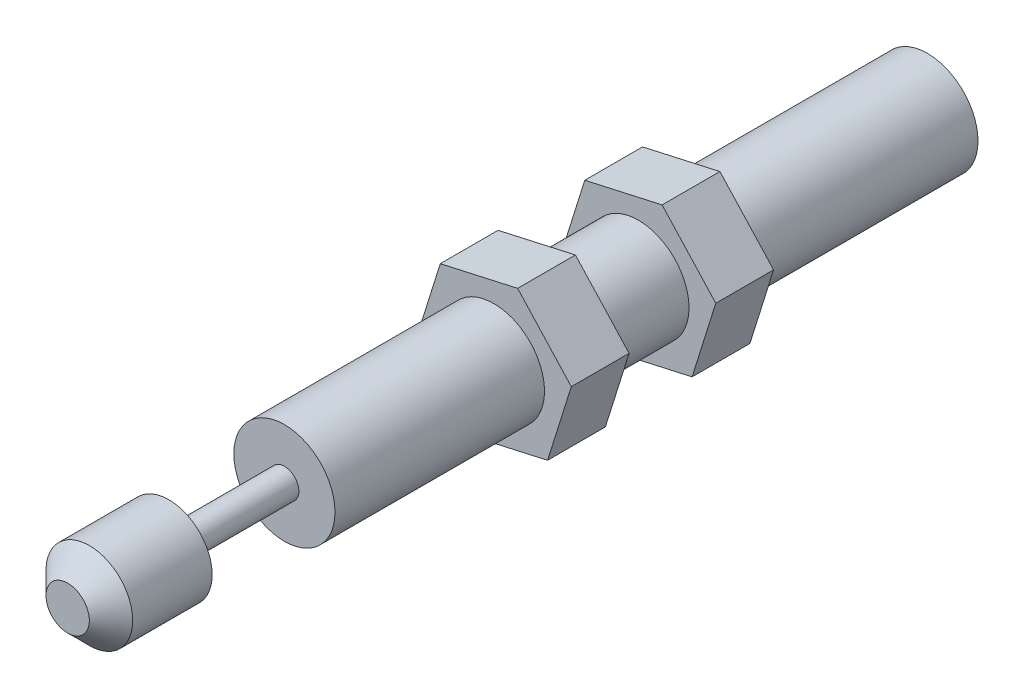
ISO-10303-21;
HEADER;
FILE_DESCRIPTION(('STEP AP214'),'2;1');
FILE_NAME('part.step','',(''),(''),'','','');
FILE_SCHEMA(('AUTOMOTIVE_DESIGN { 1 0 10303 214 1 1 1 1 }'));
ENDSEC;
DATA;
#1=APPLICATION_CONTEXT('core data for automotive mechanical design processes');
#2=APPLICATION_PROTOCOL_DEFINITION('international standard','automotive_design',2000,#1);
#3=PRODUCT_CONTEXT('',#1,'mechanical');
#4=PRODUCT('Part','Part','',(#3));
#5=PRODUCT_RELATED_PRODUCT_CATEGORY('part','',(#4));
#6=PRODUCT_DEFINITION_FORMATION('','',#4);
#7=PRODUCT_DEFINITION_CONTEXT('part definition',#1,'design');
#8=PRODUCT_DEFINITION('design','',#6,#7);
#9=PRODUCT_DEFINITION_SHAPE('','',#8);
#10=(LENGTH_UNIT() NAMED_UNIT(*) SI_UNIT(.MILLI.,.METRE.));
#11=(NAMED_UNIT(*) PLANE_ANGLE_UNIT() SI_UNIT($,.RADIAN.));
#12=(NAMED_UNIT(*) SI_UNIT($,.STERADIAN.) SOLID_ANGLE_UNIT());
#13=UNCERTAINTY_MEASURE_WITH_UNIT(LENGTH_MEASURE(1.E-05),#10,'distance_accuracy_value','');
#14=(GEOMETRIC_REPRESENTATION_CONTEXT(3) GLOBAL_UNCERTAINTY_ASSIGNED_CONTEXT((#13)) GLOBAL_UNIT_ASSIGNED_CONTEXT((#10,
#11,#12)) REPRESENTATION_CONTEXT('',''));
#15=CARTESIAN_POINT('',(0.,0.,0.));
#16=DIRECTION('',(0.,0.,1.));
#17=DIRECTION('',(1.,0.,0.));
#18=AXIS2_PLACEMENT_3D('',#15,#16,#17);
#19=CARTESIAN_POINT('',(0.,0.,89.));
#20=DIRECTION('',(0.,0.,-1.));
#21=DIRECTION('',(-1.,0.,0.));
#22=AXIS2_PLACEMENT_3D('',#19,#20,#21);
#23=CYLINDRICAL_SURFACE('',#22,7.);
#24=CARTESIAN_POINT('',(0.,0.,89.));
#25=DIRECTION('',(0.,0.,1.));
#26=DIRECTION('',(1.,0.,0.));
#27=AXIS2_PLACEMENT_3D('',#24,#25,#26);
#28=CIRCLE('',#27,7.);
#29=CARTESIAN_POINT('',(7.,0.,89.));
#30=VERTEX_POINT('',#29);
#31=EDGE_CURVE('E156',#30,#30,#28,.T.);
#32=ORIENTED_EDGE('',*,*,#31,.F.);
#33=EDGE_LOOP('',(#32));
#34=FACE_BOUND('',#33,.T.);
#35=CARTESIAN_POINT('',(0.,0.,60.));
#36=DIRECTION('',(0.,0.,-1.));
#37=DIRECTION('',(-1.,0.,0.));
#38=AXIS2_PLACEMENT_3D('',#35,#36,#37);
#39=CIRCLE('',#38,7.);
#40=CARTESIAN_POINT('',(-7.,0.,60.));
#41=VERTEX_POINT('',#40);
#42=EDGE_CURVE('E11',#41,#41,#39,.T.);
#43=ORIENTED_EDGE('',*,*,#42,.F.);
#44=EDGE_LOOP('',(#43));
#45=FACE_BOUND('',#44,.T.);
#46=ADVANCED_FACE('F34',(#34,#45),#23,.T.);
#47=CARTESIAN_POINT('',(0.,0.,89.));
#48=DIRECTION('',(0.,0.,1.));
#49=DIRECTION('',(1.,0.,0.));
#50=AXIS2_PLACEMENT_3D('',#47,#48,#49);
#51=PLANE('',#50);
#52=ORIENTED_EDGE('',*,*,#31,.T.);
#53=EDGE_LOOP('',(#52));
#54=FACE_BOUND('',#53,.T.);
#55=CARTESIAN_POINT('',(0.,0.,89.));
#56=DIRECTION('',(0.,0.,1.));
#57=DIRECTION('',(1.,0.,0.));
#58=AXIS2_PLACEMENT_3D('',#55,#56,#57);
#59=CIRCLE('',#58,2.);
#60=CARTESIAN_POINT('',(2.,0.,89.));
#61=VERTEX_POINT('',#60);
#62=EDGE_CURVE('E149',#61,#61,#59,.T.);
#63=ORIENTED_EDGE('',*,*,#62,.F.);
#64=EDGE_LOOP('',(#63));
#65=FACE_BOUND('',#64,.T.);
#66=ADVANCED_FACE('F188',(#54,#65),#51,.T.);
#67=CARTESIAN_POINT('',(0.,0.,105.));
#68=DIRECTION('',(0.,0.,-1.));
#69=DIRECTION('',(-1.,0.,0.));
#70=AXIS2_PLACEMENT_3D('',#67,#68,#69);
#71=CYLINDRICAL_SURFACE('',#70,2.);
#72=CARTESIAN_POINT('',(0.,0.,105.));
#73=DIRECTION('',(0.,0.,1.));
#74=DIRECTION('',(1.,0.,0.));
#75=AXIS2_PLACEMENT_3D('',#72,#73,#74);
#76=CIRCLE('',#75,2.);
#77=CARTESIAN_POINT('',(2.,0.,105.));
#78=VERTEX_POINT('',#77);
#79=EDGE_CURVE('E150',#78,#78,#76,.T.);
#80=ORIENTED_EDGE('',*,*,#79,.F.);
#81=EDGE_LOOP('',(#80));
#82=FACE_BOUND('',#81,.T.);
#83=ORIENTED_EDGE('',*,*,#62,.T.);
#84=EDGE_LOOP('',(#83));
#85=FACE_BOUND('',#84,.T.);
#86=ADVANCED_FACE('F193',(#82,#85),#71,.T.);
#87=CARTESIAN_POINT('',(0.,0.,105.));
#88=DIRECTION('',(0.,0.,1.));
#89=DIRECTION('',(1.,0.,0.));
#90=AXIS2_PLACEMENT_3D('',#87,#88,#89);
#91=PLANE('',#90);
#92=CARTESIAN_POINT('',(0.,0.,105.));
#93=DIRECTION('',(0.,0.,1.));
#94=DIRECTION('',(1.,0.,0.));
#95=AXIS2_PLACEMENT_3D('',#92,#93,#94);
#96=CIRCLE('',#95,6.);
#97=CARTESIAN_POINT('',(6.,0.,105.));
#98=VERTEX_POINT('',#97);
#99=EDGE_CURVE('E146',#98,#98,#96,.T.);
#100=ORIENTED_EDGE('',*,*,#99,.F.);
#101=EDGE_LOOP('',(#100));
#102=FACE_BOUND('',#101,.T.);
#103=ORIENTED_EDGE('',*,*,#79,.T.);
#104=EDGE_LOOP('',(#103));
#105=FACE_BOUND('',#104,.T.);
#106=ADVANCED_FACE('F254',(#102,#105),#91,.F.);
#107=CARTESIAN_POINT('',(0.,0.,119.));
#108=DIRECTION('',(0.,0.,-1.));
#109=DIRECTION('',(-1.,0.,0.));
#110=AXIS2_PLACEMENT_3D('',#107,#108,#109);
#111=CYLINDRICAL_SURFACE('',#110,6.);
#112=CARTESIAN_POINT('',(0.,0.,116.));
#113=DIRECTION('',(0.,0.,1.));
#114=DIRECTION('',(1.,0.,0.));
#115=AXIS2_PLACEMENT_3D('',#112,#113,#114);
#116=CIRCLE('',#115,6.);
#117=CARTESIAN_POINT('',(6.,0.,116.));
#118=VERTEX_POINT('',#117);
#119=EDGE_CURVE('E164',#118,#118,#116,.F.);
#120=ORIENTED_EDGE('',*,*,#119,.T.);
#121=EDGE_LOOP('',(#120));
#122=FACE_BOUND('',#121,.T.);
#123=ORIENTED_EDGE('',*,*,#99,.T.);
#124=EDGE_LOOP('',(#123));
#125=FACE_BOUND('',#124,.T.);
#126=ADVANCED_FACE('F252',(#122,#125),#111,.T.);
#127=CARTESIAN_POINT('',(0.,0.,119.));
#128=DIRECTION('',(0.,0.,1.));
#129=DIRECTION('',(1.,0.,0.));
#130=AXIS2_PLACEMENT_3D('',#127,#128,#129);
#131=PLANE('',#130);
#132=CARTESIAN_POINT('',(0.,0.,119.));
#133=DIRECTION('',(0.,0.,1.));
#134=DIRECTION('',(1.,0.,0.));
#135=AXIS2_PLACEMENT_3D('',#132,#133,#134);
#136=CIRCLE('',#135,2.99999999999996);
#137=CARTESIAN_POINT('',(2.99999999999996,0.,119.));
#138=VERTEX_POINT('',#137);
#139=EDGE_CURVE('E159',#138,#138,#136,.T.);
#140=ORIENTED_EDGE('',*,*,#139,.T.);
#141=EDGE_LOOP('',(#140));
#142=FACE_BOUND('',#141,.T.);
#143=ADVANCED_FACE('F249',(#142),#131,.T.);
#144=CARTESIAN_POINT('',(0.,0.,119.));
#145=DIRECTION('',(0.,0.,-1.));
#146=DIRECTION('',(-1.,0.,0.));
#147=AXIS2_PLACEMENT_3D('',#144,#145,#146);
#148=CONICAL_SURFACE('',#147,2.99999999999996,0.785398163397448);
#149=ORIENTED_EDGE('',*,*,#119,.F.);
#150=EDGE_LOOP('',(#149));
#151=FACE_BOUND('',#150,.T.);
#152=ORIENTED_EDGE('',*,*,#139,.F.);
#153=EDGE_LOOP('',(#152));
#154=FACE_BOUND('',#153,.T.);
#155=ADVANCED_FACE('F36',(#151,#154),#148,.T.);
#156=CARTESIAN_POINT('',(3.27780569084184,10.4684919251255,52.));
#157=DIRECTION('',(0.,0.,-1.));
#158=DIRECTION('',(-1.,0.,0.));
#159=AXIS2_PLACEMENT_3D('',#156,#157,#158);
#160=PLANE('',#159);
#161=DIRECTION('',(0.975863204454027,0.218382705800432,0.));
#162=VECTOR('',#161,1.);
#163=CARTESIAN_POINT('',(-7.42707710105005,8.07290895950099,52.));
#164=LINE('',#163,#162);
#165=CARTESIAN_POINT('',(-7.42707710105005,8.07290895950099,52.));
#166=VERTEX_POINT('',#165);
#167=CARTESIAN_POINT('',(3.27780569084183,10.4684919251255,52.));
#168=VERTEX_POINT('',#167);
#169=EDGE_CURVE('E330',#166,#168,#164,.T.);
#170=ORIENTED_EDGE('',*,*,#169,.T.);
#171=DIRECTION('',(0.677056573197371,-0.735930972775459,0.));
#172=VECTOR('',#171,1.);
#173=CARTESIAN_POINT('',(3.27780569084183,10.4684919251255,52.));
#174=LINE('',#173,#172);
#175=CARTESIAN_POINT('',(10.7048827918919,2.39558296562453,52.));
#176=VERTEX_POINT('',#175);
#177=EDGE_CURVE('E370',#168,#176,#174,.T.);
#178=ORIENTED_EDGE('',*,*,#177,.T.);
#179=DIRECTION('',(-0.298806631256656,-0.954313678575891,0.));
#180=VECTOR('',#179,1.);
#181=CARTESIAN_POINT('',(10.7048827918919,2.39558296562453,52.));
#182=LINE('',#181,#180);
#183=CARTESIAN_POINT('',(7.42707710105005,-8.07290895950099,52.));
#184=VERTEX_POINT('',#183);
#185=EDGE_CURVE('E365',#176,#184,#182,.T.);
#186=ORIENTED_EDGE('',*,*,#185,.T.);
#187=DIRECTION('',(-0.975863204454027,-0.218382705800433,0.));
#188=VECTOR('',#187,1.);
#189=CARTESIAN_POINT('',(7.42707710105005,-8.07290895950099,52.));
#190=LINE('',#189,#188);
#191=CARTESIAN_POINT('',(-3.27780569084183,-10.4684919251255,52.));
#192=VERTEX_POINT('',#191);
#193=EDGE_CURVE('E346',#184,#192,#190,.T.);
#194=ORIENTED_EDGE('',*,*,#193,.T.);
#195=DIRECTION('',(-0.677056573197371,0.735930972775459,0.));
#196=VECTOR('',#195,1.);
#197=CARTESIAN_POINT('',(-3.27780569084183,-10.4684919251255,52.));
#198=LINE('',#197,#196);
#199=CARTESIAN_POINT('',(-10.7048827918919,-2.39558296562453,52.));
#200=VERTEX_POINT('',#199);
#201=EDGE_CURVE('E364',#192,#200,#198,.T.);
#202=ORIENTED_EDGE('',*,*,#201,.T.);
#203=DIRECTION('',(0.298806631256656,0.954313678575891,0.));
#204=VECTOR('',#203,1.);
#205=CARTESIAN_POINT('',(-10.7048827918919,-2.39558296562453,52.));
#206=LINE('',#205,#204);
#207=EDGE_CURVE('E317',#200,#166,#206,.T.);
#208=ORIENTED_EDGE('',*,*,#207,.T.);
#209=EDGE_LOOP('',(#170,#178,#186,#194,#202,#208));
#210=FACE_BOUND('',#209,.T.);
#211=CARTESIAN_POINT('',(0.,0.,52.));
#212=DIRECTION('',(0.,0.,-1.));
#213=DIRECTION('',(-1.,0.,0.));
#214=AXIS2_PLACEMENT_3D('',#211,#212,#213);
#215=CIRCLE('',#214,7.);
#216=CARTESIAN_POINT('',(-7.,0.,52.));
#217=VERTEX_POINT('',#216);
#218=EDGE_CURVE('E38',#217,#217,#215,.T.);
#219=ORIENTED_EDGE('',*,*,#218,.F.);
#220=EDGE_LOOP('',(#219));
#221=FACE_BOUND('',#220,.T.);
#222=ADVANCED_FACE('F299',(#210,#221),#160,.T.);
#223=CARTESIAN_POINT('',(3.27780569084184,10.4684919251255,60.));
#224=DIRECTION('',(0.,0.,-1.));
#225=DIRECTION('',(-1.,0.,0.));
#226=AXIS2_PLACEMENT_3D('',#223,#224,#225);
#227=PLANE('',#226);
#228=DIRECTION('',(0.975863204454027,0.218382705800432,0.));
#229=VECTOR('',#228,1.);
#230=CARTESIAN_POINT('',(-7.42707710105005,8.07290895950099,60.));
#231=LINE('',#230,#229);
#232=CARTESIAN_POINT('',(-7.42707710105005,8.07290895950099,60.));
#233=VERTEX_POINT('',#232);
#234=CARTESIAN_POINT('',(3.27780569084183,10.4684919251255,60.));
#235=VERTEX_POINT('',#234);
#236=EDGE_CURVE('E303',#233,#235,#231,.T.);
#237=ORIENTED_EDGE('',*,*,#236,.F.);
#238=DIRECTION('',(0.298806631256656,0.954313678575891,0.));
#239=VECTOR('',#238,1.);
#240=CARTESIAN_POINT('',(-10.7048827918919,-2.39558296562453,60.));
#241=LINE('',#240,#239);
#242=CARTESIAN_POINT('',(-10.7048827918919,-2.39558296562453,60.));
#243=VERTEX_POINT('',#242);
#244=EDGE_CURVE('E328',#243,#233,#241,.T.);
#245=ORIENTED_EDGE('',*,*,#244,.F.);
#246=DIRECTION('',(-0.677056573197371,0.735930972775459,0.));
#247=VECTOR('',#246,1.);
#248=CARTESIAN_POINT('',(-3.27780569084183,-10.4684919251255,60.));
#249=LINE('',#248,#247);
#250=CARTESIAN_POINT('',(-3.27780569084183,-10.4684919251255,60.));
#251=VERTEX_POINT('',#250);
#252=EDGE_CURVE('E325',#251,#243,#249,.T.);
#253=ORIENTED_EDGE('',*,*,#252,.F.);
#254=DIRECTION('',(-0.975863204454027,-0.218382705800433,0.));
#255=VECTOR('',#254,1.);
#256=CARTESIAN_POINT('',(7.42707710105005,-8.07290895950099,60.));
#257=LINE('',#256,#255);
#258=CARTESIAN_POINT('',(7.42707710105005,-8.07290895950099,60.));
#259=VERTEX_POINT('',#258);
#260=EDGE_CURVE('E322',#259,#251,#257,.T.);
#261=ORIENTED_EDGE('',*,*,#260,.F.);
#262=DIRECTION('',(-0.298806631256656,-0.954313678575891,0.));
#263=VECTOR('',#262,1.);
#264=CARTESIAN_POINT('',(10.7048827918919,2.39558296562453,60.));
#265=LINE('',#264,#263);
#266=CARTESIAN_POINT('',(10.7048827918919,2.39558296562453,60.));
#267=VERTEX_POINT('',#266);
#268=EDGE_CURVE('E314',#267,#259,#265,.T.);
#269=ORIENTED_EDGE('',*,*,#268,.F.);
#270=DIRECTION('',(0.677056573197371,-0.735930972775459,0.));
#271=VECTOR('',#270,1.);
#272=CARTESIAN_POINT('',(3.27780569084183,10.4684919251255,60.));
#273=LINE('',#272,#271);
#274=EDGE_CURVE('E312',#235,#267,#273,.T.);
#275=ORIENTED_EDGE('',*,*,#274,.F.);
#276=EDGE_LOOP('',(#237,#245,#253,#261,#269,#275));
#277=FACE_BOUND('',#276,.T.);
#278=ORIENTED_EDGE('',*,*,#42,.T.);
#279=EDGE_LOOP('',(#278));
#280=FACE_BOUND('',#279,.T.);
#281=ADVANCED_FACE('F281',(#277,#280),#227,.F.);
#282=CARTESIAN_POINT('',(-7.42707710105005,8.07290895950099,52.));
#283=DIRECTION('',(0.218382705800432,-0.975863204454027,0.));
#284=DIRECTION('',(0.975863204454027,0.218382705800432,0.));
#285=AXIS2_PLACEMENT_3D('',#282,#283,#284);
#286=PLANE('',#285);
#287=ORIENTED_EDGE('',*,*,#236,.T.);
#288=DIRECTION('',(0.,0.,1.));
#289=VECTOR('',#288,1.);
#290=CARTESIAN_POINT('',(3.27780569084183,10.4684919251255,52.));
#291=LINE('',#290,#289);
#292=EDGE_CURVE('E213',#168,#235,#291,.T.);
#293=ORIENTED_EDGE('',*,*,#292,.F.);
#294=ORIENTED_EDGE('',*,*,#169,.F.);
#295=DIRECTION('',(0.,0.,1.));
#296=VECTOR('',#295,1.);
#297=CARTESIAN_POINT('',(-7.42707710105005,8.07290895950099,52.));
#298=LINE('',#297,#296);
#299=EDGE_CURVE('E307',#166,#233,#298,.T.);
#300=ORIENTED_EDGE('',*,*,#299,.T.);
#301=EDGE_LOOP('',(#287,#293,#294,#300));
#302=FACE_BOUND('',#301,.T.);
#303=ADVANCED_FACE('F293',(#302),#286,.F.);
#304=CARTESIAN_POINT('',(3.27780569084183,10.4684919251255,52.));
#305=DIRECTION('',(-0.735930972775459,-0.677056573197371,0.));
#306=DIRECTION('',(0.677056573197371,-0.735930972775459,0.));
#307=AXIS2_PLACEMENT_3D('',#304,#305,#306);
#308=PLANE('',#307);
#309=ORIENTED_EDGE('',*,*,#274,.T.);
#310=DIRECTION('',(0.,0.,1.));
#311=VECTOR('',#310,1.);
#312=CARTESIAN_POINT('',(10.7048827918919,2.39558296562453,52.));
#313=LINE('',#312,#311);
#314=EDGE_CURVE('E215',#176,#267,#313,.T.);
#315=ORIENTED_EDGE('',*,*,#314,.F.);
#316=ORIENTED_EDGE('',*,*,#177,.F.);
#317=ORIENTED_EDGE('',*,*,#292,.T.);
#318=EDGE_LOOP('',(#309,#315,#316,#317));
#319=FACE_BOUND('',#318,.T.);
#320=ADVANCED_FACE('F290',(#319),#308,.F.);
#321=CARTESIAN_POINT('',(10.7048827918919,2.39558296562453,52.));
#322=DIRECTION('',(-0.954313678575891,0.298806631256656,0.));
#323=DIRECTION('',(-0.298806631256656,-0.954313678575891,0.));
#324=AXIS2_PLACEMENT_3D('',#321,#322,#323);
#325=PLANE('',#324);
#326=ORIENTED_EDGE('',*,*,#268,.T.);
#327=DIRECTION('',(0.,0.,1.));
#328=VECTOR('',#327,1.);
#329=CARTESIAN_POINT('',(7.42707710105005,-8.07290895950099,52.));
#330=LINE('',#329,#328);
#331=EDGE_CURVE('E224',#184,#259,#330,.T.);
#332=ORIENTED_EDGE('',*,*,#331,.F.);
#333=ORIENTED_EDGE('',*,*,#185,.F.);
#334=ORIENTED_EDGE('',*,*,#314,.T.);
#335=EDGE_LOOP('',(#326,#332,#333,#334));
#336=FACE_BOUND('',#335,.T.);
#337=ADVANCED_FACE('F286',(#336),#325,.F.);
#338=CARTESIAN_POINT('',(7.42707710105005,-8.07290895950099,52.));
#339=DIRECTION('',(-0.218382705800433,0.975863204454027,0.));
#340=DIRECTION('',(-0.975863204454027,-0.218382705800433,0.));
#341=AXIS2_PLACEMENT_3D('',#338,#339,#340);
#342=PLANE('',#341);
#343=ORIENTED_EDGE('',*,*,#260,.T.);
#344=DIRECTION('',(0.,0.,1.));
#345=VECTOR('',#344,1.);
#346=CARTESIAN_POINT('',(-3.27780569084183,-10.4684919251255,52.));
#347=LINE('',#346,#345);
#348=EDGE_CURVE('E335',#192,#251,#347,.T.);
#349=ORIENTED_EDGE('',*,*,#348,.F.);
#350=ORIENTED_EDGE('',*,*,#193,.F.);
#351=ORIENTED_EDGE('',*,*,#331,.T.);
#352=EDGE_LOOP('',(#343,#349,#350,#351));
#353=FACE_BOUND('',#352,.T.);
#354=ADVANCED_FACE('F276',(#353),#342,.F.);
#355=CARTESIAN_POINT('',(-3.27780569084183,-10.4684919251255,52.));
#356=DIRECTION('',(0.735930972775459,0.677056573197371,0.));
#357=DIRECTION('',(-0.677056573197371,0.735930972775459,0.));
#358=AXIS2_PLACEMENT_3D('',#355,#356,#357);
#359=PLANE('',#358);
#360=ORIENTED_EDGE('',*,*,#252,.T.);
#361=DIRECTION('',(0.,0.,1.));
#362=VECTOR('',#361,1.);
#363=CARTESIAN_POINT('',(-10.7048827918919,-2.39558296562453,52.));
#364=LINE('',#363,#362);
#365=EDGE_CURVE('E332',#200,#243,#364,.T.);
#366=ORIENTED_EDGE('',*,*,#365,.F.);
#367=ORIENTED_EDGE('',*,*,#201,.F.);
#368=ORIENTED_EDGE('',*,*,#348,.T.);
#369=EDGE_LOOP('',(#360,#366,#367,#368));
#370=FACE_BOUND('',#369,.T.);
#371=ADVANCED_FACE('F269',(#370),#359,.F.);
#372=CARTESIAN_POINT('',(-10.7048827918919,-2.39558296562453,52.));
#373=DIRECTION('',(0.954313678575891,-0.298806631256656,0.));
#374=DIRECTION('',(0.298806631256656,0.954313678575891,0.));
#375=AXIS2_PLACEMENT_3D('',#372,#373,#374);
#376=PLANE('',#375);
#377=ORIENTED_EDGE('',*,*,#244,.T.);
#378=ORIENTED_EDGE('',*,*,#299,.F.);
#379=ORIENTED_EDGE('',*,*,#207,.F.);
#380=ORIENTED_EDGE('',*,*,#365,.T.);
#381=EDGE_LOOP('',(#377,#378,#379,#380));
#382=FACE_BOUND('',#381,.T.);
#383=ADVANCED_FACE('F264',(#382),#376,.F.);
#384=CARTESIAN_POINT('',(0.,0.,0.));
#385=DIRECTION('',(0.,0.,1.));
#386=DIRECTION('',(1.,0.,0.));
#387=AXIS2_PLACEMENT_3D('',#384,#385,#386);
#388=PLANE('',#387);
#389=CARTESIAN_POINT('',(0.,0.,0.));
#390=DIRECTION('',(0.,0.,1.));
#391=DIRECTION('',(1.,0.,0.));
#392=AXIS2_PLACEMENT_3D('',#389,#390,#391);
#393=CIRCLE('',#392,7.);
#394=CARTESIAN_POINT('',(7.,0.,0.));
#395=VERTEX_POINT('',#394);
#396=EDGE_CURVE('E153',#395,#395,#393,.T.);
#397=ORIENTED_EDGE('',*,*,#396,.F.);
#398=EDGE_LOOP('',(#397));
#399=FACE_BOUND('',#398,.T.);
#400=ADVANCED_FACE('F183',(#399),#388,.F.);
#401=CARTESIAN_POINT('',(0.,0.,32.));
#402=DIRECTION('',(0.,0.,-1.));
#403=DIRECTION('',(-1.,0.,0.));
#404=AXIS2_PLACEMENT_3D('',#401,#402,#403);
#405=CIRCLE('',#404,7.);
#406=CARTESIAN_POINT('',(-7.,0.,32.));
#407=VERTEX_POINT('',#406);
#408=EDGE_CURVE('E145',#407,#407,#405,.T.);
#409=ORIENTED_EDGE('',*,*,#408,.T.);
#410=EDGE_LOOP('',(#409));
#411=FACE_BOUND('',#410,.T.);
#412=ORIENTED_EDGE('',*,*,#396,.T.);
#413=EDGE_LOOP('',(#412));
#414=FACE_BOUND('',#413,.T.);
#415=ADVANCED_FACE('F172',(#411,#414),#23,.T.);
#416=CARTESIAN_POINT('',(3.27780569084184,10.4684919251255,32.));
#417=DIRECTION('',(0.,0.,-1.));
#418=DIRECTION('',(-1.,0.,0.));
#419=AXIS2_PLACEMENT_3D('',#416,#417,#418);
#420=PLANE('',#419);
#421=DIRECTION('',(0.975863204454027,0.218382705800432,0.));
#422=VECTOR('',#421,1.);
#423=CARTESIAN_POINT('',(-7.42707710105005,8.07290895950099,32.));
#424=LINE('',#423,#422);
#425=CARTESIAN_POINT('',(-7.42707710105005,8.07290895950099,32.));
#426=VERTEX_POINT('',#425);
#427=CARTESIAN_POINT('',(3.27780569084183,10.4684919251255,32.));
#428=VERTEX_POINT('',#427);
#429=EDGE_CURVE('E136',#426,#428,#424,.T.);
#430=ORIENTED_EDGE('',*,*,#429,.T.);
#431=DIRECTION('',(0.677056573197371,-0.735930972775459,0.));
#432=VECTOR('',#431,1.);
#433=CARTESIAN_POINT('',(3.27780569084183,10.4684919251255,32.));
#434=LINE('',#433,#432);
#435=CARTESIAN_POINT('',(10.7048827918919,2.39558296562453,32.));
#436=VERTEX_POINT('',#435);
#437=EDGE_CURVE('E91',#428,#436,#434,.T.);
#438=ORIENTED_EDGE('',*,*,#437,.T.);
#439=DIRECTION('',(-0.298806631256656,-0.954313678575891,0.));
#440=VECTOR('',#439,1.);
#441=CARTESIAN_POINT('',(10.7048827918919,2.39558296562453,32.));
#442=LINE('',#441,#440);
#443=CARTESIAN_POINT('',(7.42707710105005,-8.07290895950099,32.));
#444=VERTEX_POINT('',#443);
#445=EDGE_CURVE('E108',#436,#444,#442,.T.);
#446=ORIENTED_EDGE('',*,*,#445,.T.);
#447=DIRECTION('',(-0.975863204454027,-0.218382705800433,0.));
#448=VECTOR('',#447,1.);
#449=CARTESIAN_POINT('',(7.42707710105005,-8.07290895950099,32.));
#450=LINE('',#449,#448);
#451=CARTESIAN_POINT('',(-3.27780569084183,-10.4684919251255,32.));
#452=VERTEX_POINT('',#451);
#453=EDGE_CURVE('E101',#444,#452,#450,.T.);
#454=ORIENTED_EDGE('',*,*,#453,.T.);
#455=DIRECTION('',(-0.677056573197371,0.735930972775459,0.));
#456=VECTOR('',#455,1.);
#457=CARTESIAN_POINT('',(-3.27780569084183,-10.4684919251255,32.));
#458=LINE('',#457,#456);
#459=CARTESIAN_POINT('',(-10.7048827918919,-2.39558296562453,32.));
#460=VERTEX_POINT('',#459);
#461=EDGE_CURVE('E106',#452,#460,#458,.T.);
#462=ORIENTED_EDGE('',*,*,#461,.T.);
#463=DIRECTION('',(0.298806631256656,0.954313678575891,0.));
#464=VECTOR('',#463,1.);
#465=CARTESIAN_POINT('',(-10.7048827918919,-2.39558296562453,32.));
#466=LINE('',#465,#464);
#467=EDGE_CURVE('E52',#460,#426,#466,.T.);
#468=ORIENTED_EDGE('',*,*,#467,.T.);
#469=EDGE_LOOP('',(#430,#438,#446,#454,#462,#468));
#470=FACE_BOUND('',#469,.T.);
#471=ORIENTED_EDGE('',*,*,#408,.F.);
#472=EDGE_LOOP('',(#471));
#473=FACE_BOUND('',#472,.T.);
#474=ADVANCED_FACE('F103',(#470,#473),#420,.T.);
#475=CARTESIAN_POINT('',(3.27780569084183,10.4684919251255,32.));
#476=DIRECTION('',(-0.735930972775459,-0.677056573197371,0.));
#477=DIRECTION('',(0.677056573197371,-0.735930972775459,0.));
#478=AXIS2_PLACEMENT_3D('',#475,#476,#477);
#479=PLANE('',#478);
#480=DIRECTION('',(0.677056573197371,-0.735930972775459,0.));
#481=VECTOR('',#480,1.);
#482=CARTESIAN_POINT('',(3.27780569084183,10.4684919251255,40.));
#483=LINE('',#482,#481);
#484=CARTESIAN_POINT('',(3.27780569084183,10.4684919251255,40.));
#485=VERTEX_POINT('',#484);
#486=CARTESIAN_POINT('',(10.7048827918919,2.39558296562453,40.));
#487=VERTEX_POINT('',#486);
#488=EDGE_CURVE('E129',#485,#487,#483,.T.);
#489=ORIENTED_EDGE('',*,*,#488,.T.);
#490=DIRECTION('',(0.,0.,1.));
#491=VECTOR('',#490,1.);
#492=CARTESIAN_POINT('',(10.7048827918919,2.39558296562453,32.));
#493=LINE('',#492,#491);
#494=EDGE_CURVE('E140',#436,#487,#493,.T.);
#495=ORIENTED_EDGE('',*,*,#494,.F.);
#496=ORIENTED_EDGE('',*,*,#437,.F.);
#497=DIRECTION('',(0.,0.,1.));
#498=VECTOR('',#497,1.);
#499=CARTESIAN_POINT('',(3.27780569084183,10.4684919251255,32.));
#500=LINE('',#499,#498);
#501=EDGE_CURVE('E143',#428,#485,#500,.T.);
#502=ORIENTED_EDGE('',*,*,#501,.T.);
#503=EDGE_LOOP('',(#489,#495,#496,#502));
#504=FACE_BOUND('',#503,.T.);
#505=ADVANCED_FACE('F175',(#504),#479,.F.);
#506=CARTESIAN_POINT('',(10.7048827918919,2.39558296562453,32.));
#507=DIRECTION('',(-0.954313678575891,0.298806631256656,0.));
#508=DIRECTION('',(-0.298806631256656,-0.954313678575891,0.));
#509=AXIS2_PLACEMENT_3D('',#506,#507,#508);
#510=PLANE('',#509);
#511=DIRECTION('',(-0.298806631256656,-0.954313678575891,0.));
#512=VECTOR('',#511,1.);
#513=CARTESIAN_POINT('',(10.7048827918919,2.39558296562453,40.));
#514=LINE('',#513,#512);
#515=CARTESIAN_POINT('',(7.42707710105005,-8.07290895950099,40.));
#516=VERTEX_POINT('',#515);
#517=EDGE_CURVE('E131',#487,#516,#514,.T.);
#518=ORIENTED_EDGE('',*,*,#517,.T.);
#519=DIRECTION('',(0.,0.,1.));
#520=VECTOR('',#519,1.);
#521=CARTESIAN_POINT('',(7.42707710105005,-8.07290895950099,32.));
#522=LINE('',#521,#520);
#523=EDGE_CURVE('E117',#444,#516,#522,.T.);
#524=ORIENTED_EDGE('',*,*,#523,.F.);
#525=ORIENTED_EDGE('',*,*,#445,.F.);
#526=ORIENTED_EDGE('',*,*,#494,.T.);
#527=EDGE_LOOP('',(#518,#524,#525,#526));
#528=FACE_BOUND('',#527,.T.);
#529=ADVANCED_FACE('F181',(#528),#510,.F.);
#530=CARTESIAN_POINT('',(7.42707710105005,-8.07290895950099,32.));
#531=DIRECTION('',(-0.218382705800433,0.975863204454027,0.));
#532=DIRECTION('',(-0.975863204454027,-0.218382705800433,0.));
#533=AXIS2_PLACEMENT_3D('',#530,#531,#532);
#534=PLANE('',#533);
#535=DIRECTION('',(-0.975863204454027,-0.218382705800433,0.));
#536=VECTOR('',#535,1.);
#537=CARTESIAN_POINT('',(7.42707710105005,-8.07290895950099,40.));
#538=LINE('',#537,#536);
#539=CARTESIAN_POINT('',(-3.27780569084183,-10.4684919251255,40.));
#540=VERTEX_POINT('',#539);
#541=EDGE_CURVE('E116',#516,#540,#538,.T.);
#542=ORIENTED_EDGE('',*,*,#541,.T.);
#543=DIRECTION('',(0.,0.,1.));
#544=VECTOR('',#543,1.);
#545=CARTESIAN_POINT('',(-3.27780569084183,-10.4684919251255,32.));
#546=LINE('',#545,#544);
#547=EDGE_CURVE('E113',#452,#540,#546,.T.);
#548=ORIENTED_EDGE('',*,*,#547,.F.);
#549=ORIENTED_EDGE('',*,*,#453,.F.);
#550=ORIENTED_EDGE('',*,*,#523,.T.);
#551=EDGE_LOOP('',(#542,#548,#549,#550));
#552=FACE_BOUND('',#551,.T.);
#553=ADVANCED_FACE('F114',(#552),#534,.F.);
#554=CARTESIAN_POINT('',(-3.27780569084183,-10.4684919251255,32.));
#555=DIRECTION('',(0.735930972775459,0.677056573197371,0.));
#556=DIRECTION('',(-0.677056573197371,0.735930972775459,0.));
#557=AXIS2_PLACEMENT_3D('',#554,#555,#556);
#558=PLANE('',#557);
#559=DIRECTION('',(-0.677056573197371,0.735930972775459,0.));
#560=VECTOR('',#559,1.);
#561=CARTESIAN_POINT('',(-3.27780569084183,-10.4684919251255,40.));
#562=LINE('',#561,#560);
#563=CARTESIAN_POINT('',(-10.7048827918919,-2.39558296562453,40.));
#564=VERTEX_POINT('',#563);
#565=EDGE_CURVE('E76',#540,#564,#562,.T.);
#566=ORIENTED_EDGE('',*,*,#565,.T.);
#567=DIRECTION('',(0.,0.,1.));
#568=VECTOR('',#567,1.);
#569=CARTESIAN_POINT('',(-10.7048827918919,-2.39558296562453,32.));
#570=LINE('',#569,#568);
#571=EDGE_CURVE('E118',#460,#564,#570,.T.);
#572=ORIENTED_EDGE('',*,*,#571,.F.);
#573=ORIENTED_EDGE('',*,*,#461,.F.);
#574=ORIENTED_EDGE('',*,*,#547,.T.);
#575=EDGE_LOOP('',(#566,#572,#573,#574));
#576=FACE_BOUND('',#575,.T.);
#577=ADVANCED_FACE('F120',(#576),#558,.F.);
#578=CARTESIAN_POINT('',(-10.7048827918919,-2.39558296562453,32.));
#579=DIRECTION('',(0.954313678575891,-0.298806631256656,0.));
#580=DIRECTION('',(0.298806631256656,0.954313678575891,0.));
#581=AXIS2_PLACEMENT_3D('',#578,#579,#580);
#582=PLANE('',#581);
#583=DIRECTION('',(0.298806631256656,0.954313678575891,0.));
#584=VECTOR('',#583,1.);
#585=CARTESIAN_POINT('',(-10.7048827918919,-2.39558296562453,40.));
#586=LINE('',#585,#584);
#587=CARTESIAN_POINT('',(-7.42707710105005,8.07290895950099,40.));
#588=VERTEX_POINT('',#587);
#589=EDGE_CURVE('E82',#564,#588,#586,.T.);
#590=ORIENTED_EDGE('',*,*,#589,.T.);
#591=DIRECTION('',(0.,0.,1.));
#592=VECTOR('',#591,1.);
#593=CARTESIAN_POINT('',(-7.42707710105005,8.07290895950099,32.));
#594=LINE('',#593,#592);
#595=EDGE_CURVE('E122',#426,#588,#594,.T.);
#596=ORIENTED_EDGE('',*,*,#595,.F.);
#597=ORIENTED_EDGE('',*,*,#467,.F.);
#598=ORIENTED_EDGE('',*,*,#571,.T.);
#599=EDGE_LOOP('',(#590,#596,#597,#598));
#600=FACE_BOUND('',#599,.T.);
#601=ADVANCED_FACE('F235',(#600),#582,.F.);
#602=CARTESIAN_POINT('',(-7.42707710105005,8.07290895950099,32.));
#603=DIRECTION('',(0.218382705800432,-0.975863204454027,0.));
#604=DIRECTION('',(0.975863204454027,0.218382705800432,0.));
#605=AXIS2_PLACEMENT_3D('',#602,#603,#604);
#606=PLANE('',#605);
#607=DIRECTION('',(0.975863204454027,0.218382705800432,0.));
#608=VECTOR('',#607,1.);
#609=CARTESIAN_POINT('',(-7.42707710105005,8.07290895950099,40.));
#610=LINE('',#609,#608);
#611=EDGE_CURVE('E126',#588,#485,#610,.T.);
#612=ORIENTED_EDGE('',*,*,#611,.T.);
#613=ORIENTED_EDGE('',*,*,#501,.F.);
#614=ORIENTED_EDGE('',*,*,#429,.F.);
#615=ORIENTED_EDGE('',*,*,#595,.T.);
#616=EDGE_LOOP('',(#612,#613,#614,#615));
#617=FACE_BOUND('',#616,.T.);
#618=ADVANCED_FACE('F205',(#617),#606,.F.);
#619=CARTESIAN_POINT('',(3.27780569084184,10.4684919251255,40.));
#620=DIRECTION('',(0.,0.,-1.));
#621=DIRECTION('',(-1.,0.,0.));
#622=AXIS2_PLACEMENT_3D('',#619,#620,#621);
#623=PLANE('',#622);
#624=ORIENTED_EDGE('',*,*,#611,.F.);
#625=ORIENTED_EDGE('',*,*,#589,.F.);
#626=ORIENTED_EDGE('',*,*,#565,.F.);
#627=ORIENTED_EDGE('',*,*,#541,.F.);
#628=ORIENTED_EDGE('',*,*,#517,.F.);
#629=ORIENTED_EDGE('',*,*,#488,.F.);
#630=EDGE_LOOP('',(#624,#625,#626,#627,#628,#629));
#631=FACE_BOUND('',#630,.T.);
#632=CARTESIAN_POINT('',(0.,0.,40.));
#633=DIRECTION('',(0.,0.,-1.));
#634=DIRECTION('',(-1.,0.,0.));
#635=AXIS2_PLACEMENT_3D('',#632,#633,#634);
#636=CIRCLE('',#635,7.);
#637=CARTESIAN_POINT('',(-7.,0.,40.));
#638=VERTEX_POINT('',#637);
#639=EDGE_CURVE('E44',#638,#638,#636,.T.);
#640=ORIENTED_EDGE('',*,*,#639,.T.);
#641=EDGE_LOOP('',(#640));
#642=FACE_BOUND('',#641,.T.);
#643=ADVANCED_FACE('F200',(#631,#642),#623,.F.);
#644=ORIENTED_EDGE('',*,*,#218,.T.);
#645=EDGE_LOOP('',(#644));
#646=FACE_BOUND('',#645,.T.);
#647=ORIENTED_EDGE('',*,*,#639,.F.);
#648=EDGE_LOOP('',(#647));
#649=FACE_BOUND('',#648,.T.);
#650=ADVANCED_FACE('F184',(#646,#649),#23,.T.);
#651=CLOSED_SHELL('',(#46,#66,#86,#106,#126,#143,#155,#222,#281,#303,#320,#337,#354,#371,#383,
#400,#415,#474,#505,#529,#553,#577,#601,#618,#643,#650));
#652=MANIFOLD_SOLID_BREP('B2',#651);
#653=ADVANCED_BREP_SHAPE_REPRESENTATION('',(#18,#652),#14);
#654=SHAPE_DEFINITION_REPRESENTATION(#9,#653);
ENDSEC;
END-ISO-10303-21;
